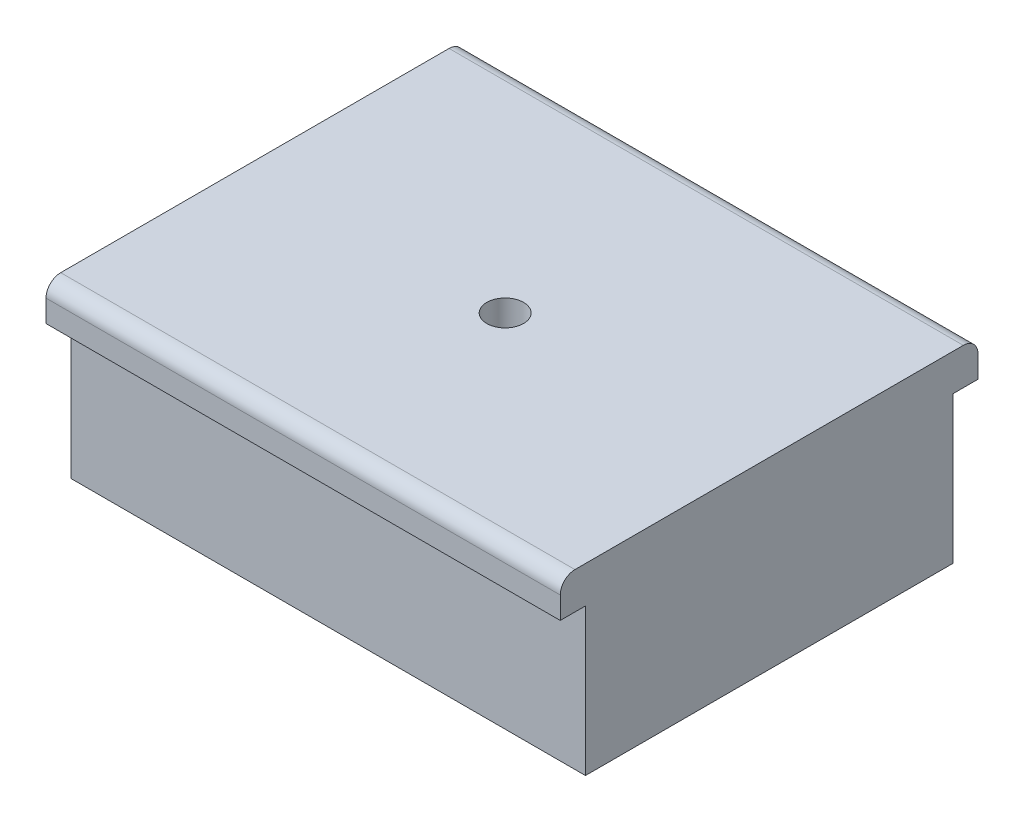
ISO-10303-21;
HEADER;
FILE_DESCRIPTION(('STEP AP214'),'2;1');
FILE_NAME('part.step','',(''),(''),'','','');
FILE_SCHEMA(('AUTOMOTIVE_DESIGN { 1 0 10303 214 1 1 1 1 }'));
ENDSEC;
DATA;
#1=APPLICATION_CONTEXT('core data for automotive mechanical design processes');
#2=APPLICATION_PROTOCOL_DEFINITION('international standard','automotive_design',2000,#1);
#3=PRODUCT_CONTEXT('',#1,'mechanical');
#4=PRODUCT('Part','Part','',(#3));
#5=PRODUCT_RELATED_PRODUCT_CATEGORY('part','',(#4));
#6=PRODUCT_DEFINITION_FORMATION('','',#4);
#7=PRODUCT_DEFINITION_CONTEXT('part definition',#1,'design');
#8=PRODUCT_DEFINITION('design','',#6,#7);
#9=PRODUCT_DEFINITION_SHAPE('','',#8);
#10=(LENGTH_UNIT() NAMED_UNIT(*) SI_UNIT(.MILLI.,.METRE.));
#11=(NAMED_UNIT(*) PLANE_ANGLE_UNIT() SI_UNIT($,.RADIAN.));
#12=(NAMED_UNIT(*) SI_UNIT($,.STERADIAN.) SOLID_ANGLE_UNIT());
#13=UNCERTAINTY_MEASURE_WITH_UNIT(LENGTH_MEASURE(1.E-05),#10,'distance_accuracy_value','');
#14=(GEOMETRIC_REPRESENTATION_CONTEXT(3) GLOBAL_UNCERTAINTY_ASSIGNED_CONTEXT((#13)) GLOBAL_UNIT_ASSIGNED_CONTEXT((#10,
#11,#12)) REPRESENTATION_CONTEXT('',''));
#15=CARTESIAN_POINT('',(0.,0.,0.));
#16=DIRECTION('',(0.,0.,1.));
#17=DIRECTION('',(1.,0.,0.));
#18=AXIS2_PLACEMENT_3D('',#15,#16,#17);
#19=CARTESIAN_POINT('',(1778.,508.,0.));
#20=DIRECTION('',(0.,0.,-1.));
#21=DIRECTION('',(0.,1.,0.));
#22=AXIS2_PLACEMENT_3D('',#19,#20,#21);
#23=PLANE('',#22);
#24=DIRECTION('',(0.,-1.,0.));
#25=VECTOR('',#24,1.);
#26=CARTESIAN_POINT('',(0.,508.,0.));
#27=LINE('',#26,#25);
#28=CARTESIAN_POINT('',(0.,508.,0.));
#29=VERTEX_POINT('',#28);
#30=CARTESIAN_POINT('',(0.,0.,0.));
#31=VERTEX_POINT('',#30);
#32=EDGE_CURVE('E151',#29,#31,#27,.T.);
#33=ORIENTED_EDGE('',*,*,#32,.T.);
#34=DIRECTION('',(-1.,0.,0.));
#35=VECTOR('',#34,1.);
#36=CARTESIAN_POINT('',(1778.,0.,0.));
#37=LINE('',#36,#35);
#38=CARTESIAN_POINT('',(1778.,0.,0.));
#39=VERTEX_POINT('',#38);
#40=EDGE_CURVE('E11',#39,#31,#37,.T.);
#41=ORIENTED_EDGE('',*,*,#40,.F.);
#42=DIRECTION('',(0.,-1.,0.));
#43=VECTOR('',#42,1.);
#44=CARTESIAN_POINT('',(1778.,508.,0.));
#45=LINE('',#44,#43);
#46=CARTESIAN_POINT('',(1778.,508.,0.));
#47=VERTEX_POINT('',#46);
#48=EDGE_CURVE('E175',#47,#39,#45,.T.);
#49=ORIENTED_EDGE('',*,*,#48,.F.);
#50=DIRECTION('',(-1.,0.,0.));
#51=VECTOR('',#50,1.);
#52=CARTESIAN_POINT('',(1778.,508.,0.));
#53=LINE('',#52,#51);
#54=EDGE_CURVE('E146',#47,#29,#53,.T.);
#55=ORIENTED_EDGE('',*,*,#54,.T.);
#56=EDGE_LOOP('',(#33,#41,#49,#55));
#57=FACE_BOUND('',#56,.T.);
#58=ADVANCED_FACE('F44',(#57),#23,.F.);
#59=CARTESIAN_POINT('',(1778.,0.,0.));
#60=DIRECTION('',(0.,1.,0.));
#61=DIRECTION('',(0.,0.,1.));
#62=AXIS2_PLACEMENT_3D('',#59,#60,#61);
#63=PLANE('',#62);
#64=CARTESIAN_POINT('',(889.,0.,-611.32732770544));
#65=DIRECTION('',(0.,1.,0.));
#66=DIRECTION('',(0.,0.,1.));
#67=AXIS2_PLACEMENT_3D('',#64,#65,#66);
#68=CIRCLE('',#67,63.5);
#69=CARTESIAN_POINT('',(889.,0.,-547.82732770544));
#70=VERTEX_POINT('',#69);
#71=EDGE_CURVE('E160',#70,#70,#68,.T.);
#72=ORIENTED_EDGE('',*,*,#71,.T.);
#73=EDGE_LOOP('',(#72));
#74=FACE_BOUND('',#73,.T.);
#75=DIRECTION('',(0.,0.,-1.));
#76=VECTOR('',#75,1.);
#77=CARTESIAN_POINT('',(0.,0.,0.));
#78=LINE('',#77,#76);
#79=CARTESIAN_POINT('',(0.,0.,-1270.));
#80=VERTEX_POINT('',#79);
#81=EDGE_CURVE('E157',#31,#80,#78,.T.);
#82=ORIENTED_EDGE('',*,*,#81,.T.);
#83=DIRECTION('',(-1.,0.,0.));
#84=VECTOR('',#83,1.);
#85=CARTESIAN_POINT('',(1778.,0.,-1270.));
#86=LINE('',#85,#84);
#87=CARTESIAN_POINT('',(1778.,0.,-1270.));
#88=VERTEX_POINT('',#87);
#89=EDGE_CURVE('E52',#88,#80,#86,.T.);
#90=ORIENTED_EDGE('',*,*,#89,.F.);
#91=DIRECTION('',(0.,0.,-1.));
#92=VECTOR('',#91,1.);
#93=CARTESIAN_POINT('',(1778.,0.,0.));
#94=LINE('',#93,#92);
#95=EDGE_CURVE('E109',#39,#88,#94,.T.);
#96=ORIENTED_EDGE('',*,*,#95,.F.);
#97=ORIENTED_EDGE('',*,*,#40,.T.);
#98=EDGE_LOOP('',(#82,#90,#96,#97));
#99=FACE_BOUND('',#98,.T.);
#100=ADVANCED_FACE('F249',(#74,#99),#63,.F.);
#101=CARTESIAN_POINT('',(1778.,0.,-1270.));
#102=DIRECTION('',(0.,0.,1.));
#103=DIRECTION('',(1.,0.,0.));
#104=AXIS2_PLACEMENT_3D('',#101,#102,#103);
#105=PLANE('',#104);
#106=DIRECTION('',(0.,1.,0.));
#107=VECTOR('',#106,1.);
#108=CARTESIAN_POINT('',(0.,0.,-1270.));
#109=LINE('',#108,#107);
#110=CARTESIAN_POINT('',(0.,508.,-1270.));
#111=VERTEX_POINT('',#110);
#112=EDGE_CURVE('E159',#80,#111,#109,.T.);
#113=ORIENTED_EDGE('',*,*,#112,.T.);
#114=DIRECTION('',(-1.,0.,0.));
#115=VECTOR('',#114,1.);
#116=CARTESIAN_POINT('',(1778.,508.,-1270.));
#117=LINE('',#116,#115);
#118=CARTESIAN_POINT('',(1778.,508.,-1270.));
#119=VERTEX_POINT('',#118);
#120=EDGE_CURVE('E184',#119,#111,#117,.T.);
#121=ORIENTED_EDGE('',*,*,#120,.F.);
#122=DIRECTION('',(0.,1.,0.));
#123=VECTOR('',#122,1.);
#124=CARTESIAN_POINT('',(1778.,0.,-1270.));
#125=LINE('',#124,#123);
#126=EDGE_CURVE('E194',#88,#119,#125,.T.);
#127=ORIENTED_EDGE('',*,*,#126,.F.);
#128=ORIENTED_EDGE('',*,*,#89,.T.);
#129=EDGE_LOOP('',(#113,#121,#127,#128));
#130=FACE_BOUND('',#129,.T.);
#131=ADVANCED_FACE('F192',(#130),#105,.F.);
#132=CARTESIAN_POINT('',(1778.,508.,-1270.));
#133=DIRECTION('',(0.,1.,0.));
#134=DIRECTION('',(0.,0.,1.));
#135=AXIS2_PLACEMENT_3D('',#132,#133,#134);
#136=PLANE('',#135);
#137=DIRECTION('',(0.,0.,-1.));
#138=VECTOR('',#137,1.);
#139=CARTESIAN_POINT('',(0.,508.,-1270.));
#140=LINE('',#139,#138);
#141=CARTESIAN_POINT('',(0.,508.,-1357.17267229456));
#142=VERTEX_POINT('',#141);
#143=EDGE_CURVE('E163',#111,#142,#140,.T.);
#144=ORIENTED_EDGE('',*,*,#143,.T.);
#145=DIRECTION('',(-1.,0.,0.));
#146=VECTOR('',#145,1.);
#147=CARTESIAN_POINT('',(1778.,508.,-1357.17267229456));
#148=LINE('',#147,#146);
#149=CARTESIAN_POINT('',(1778.,508.,-1357.17267229456));
#150=VERTEX_POINT('',#149);
#151=EDGE_CURVE('E185',#150,#142,#148,.T.);
#152=ORIENTED_EDGE('',*,*,#151,.F.);
#153=DIRECTION('',(0.,0.,-1.));
#154=VECTOR('',#153,1.);
#155=CARTESIAN_POINT('',(1778.,508.,-1270.));
#156=LINE('',#155,#154);
#157=EDGE_CURVE('E213',#119,#150,#156,.T.);
#158=ORIENTED_EDGE('',*,*,#157,.F.);
#159=ORIENTED_EDGE('',*,*,#120,.T.);
#160=EDGE_LOOP('',(#144,#152,#158,#159));
#161=FACE_BOUND('',#160,.T.);
#162=ADVANCED_FACE('F205',(#161),#136,.F.);
#163=CARTESIAN_POINT('',(1778.,508.,-1357.17267229456));
#164=DIRECTION('',(0.,0.,1.));
#165=DIRECTION('',(1.,0.,0.));
#166=AXIS2_PLACEMENT_3D('',#163,#164,#165);
#167=PLANE('',#166);
#168=DIRECTION('',(0.,1.,0.));
#169=VECTOR('',#168,1.);
#170=CARTESIAN_POINT('',(0.,508.,-1357.17267229456));
#171=LINE('',#170,#169);
#172=CARTESIAN_POINT('',(0.,584.2,-1357.17267229456));
#173=VERTEX_POINT('',#172);
#174=EDGE_CURVE('E161',#142,#173,#171,.T.);
#175=ORIENTED_EDGE('',*,*,#174,.T.);
#176=DIRECTION('',(-1.,0.,0.));
#177=VECTOR('',#176,1.);
#178=CARTESIAN_POINT('',(1778.,584.2,-1357.17267229456));
#179=LINE('',#178,#177);
#180=CARTESIAN_POINT('',(1778.,584.2,-1357.17267229456));
#181=VERTEX_POINT('',#180);
#182=EDGE_CURVE('E177',#181,#173,#179,.T.);
#183=ORIENTED_EDGE('',*,*,#182,.F.);
#184=DIRECTION('',(0.,1.,0.));
#185=VECTOR('',#184,1.);
#186=CARTESIAN_POINT('',(1778.,508.,-1357.17267229456));
#187=LINE('',#186,#185);
#188=EDGE_CURVE('E206',#150,#181,#187,.T.);
#189=ORIENTED_EDGE('',*,*,#188,.F.);
#190=ORIENTED_EDGE('',*,*,#151,.T.);
#191=EDGE_LOOP('',(#175,#183,#189,#190));
#192=FACE_BOUND('',#191,.T.);
#193=ADVANCED_FACE('F208',(#192),#167,.F.);
#194=CARTESIAN_POINT('',(1778.,584.2,-1306.37267229456));
#195=DIRECTION('',(-1.,0.,0.));
#196=DIRECTION('',(0.,0.,1.));
#197=AXIS2_PLACEMENT_3D('',#194,#195,#196);
#198=CYLINDRICAL_SURFACE('',#197,50.8);
#199=CARTESIAN_POINT('',(0.,584.2,-1306.37267229456));
#200=DIRECTION('',(1.,0.,0.));
#201=DIRECTION('',(0.,0.,-1.));
#202=AXIS2_PLACEMENT_3D('',#199,#200,#201);
#203=CIRCLE('',#202,50.8);
#204=CARTESIAN_POINT('',(0.,635.,-1306.37267229456));
#205=VERTEX_POINT('',#204);
#206=EDGE_CURVE('E164',#173,#205,#203,.T.);
#207=ORIENTED_EDGE('',*,*,#206,.T.);
#208=DIRECTION('',(-1.,0.,0.));
#209=VECTOR('',#208,1.);
#210=CARTESIAN_POINT('',(1778.,635.,-1306.37267229456));
#211=LINE('',#210,#209);
#212=CARTESIAN_POINT('',(1778.,635.,-1306.37267229456));
#213=VERTEX_POINT('',#212);
#214=EDGE_CURVE('E176',#213,#205,#211,.T.);
#215=ORIENTED_EDGE('',*,*,#214,.F.);
#216=CARTESIAN_POINT('',(1778.,584.2,-1306.37267229456));
#217=DIRECTION('',(1.,0.,0.));
#218=DIRECTION('',(0.,0.,-1.));
#219=AXIS2_PLACEMENT_3D('',#216,#217,#218);
#220=CIRCLE('',#219,50.8);
#221=EDGE_CURVE('E209',#181,#213,#220,.T.);
#222=ORIENTED_EDGE('',*,*,#221,.F.);
#223=ORIENTED_EDGE('',*,*,#182,.T.);
#224=EDGE_LOOP('',(#207,#215,#222,#223));
#225=FACE_BOUND('',#224,.T.);
#226=ADVANCED_FACE('F231',(#225),#198,.T.);
#227=CARTESIAN_POINT('',(1778.,635.,-1306.37267229456));
#228=DIRECTION('',(0.,-1.,0.));
#229=DIRECTION('',(0.,0.,-1.));
#230=AXIS2_PLACEMENT_3D('',#227,#228,#229);
#231=PLANE('',#230);
#232=CARTESIAN_POINT('',(889.,635.,-611.32732770544));
#233=DIRECTION('',(0.,1.,0.));
#234=DIRECTION('',(0.,0.,1.));
#235=AXIS2_PLACEMENT_3D('',#232,#233,#234);
#236=CIRCLE('',#235,63.5);
#237=CARTESIAN_POINT('',(889.,635.,-547.82732770544));
#238=VERTEX_POINT('',#237);
#239=EDGE_CURVE('E221',#238,#238,#236,.T.);
#240=ORIENTED_EDGE('',*,*,#239,.F.);
#241=EDGE_LOOP('',(#240));
#242=FACE_BOUND('',#241,.T.);
#243=DIRECTION('',(0.,0.,1.));
#244=VECTOR('',#243,1.);
#245=CARTESIAN_POINT('',(0.,635.,-1306.37267229456));
#246=LINE('',#245,#244);
#247=CARTESIAN_POINT('',(0.,635.,36.3726722945599));
#248=VERTEX_POINT('',#247);
#249=EDGE_CURVE('E167',#205,#248,#246,.T.);
#250=ORIENTED_EDGE('',*,*,#249,.T.);
#251=DIRECTION('',(-1.,0.,0.));
#252=VECTOR('',#251,1.);
#253=CARTESIAN_POINT('',(1778.,635.,36.3726722945599));
#254=LINE('',#253,#252);
#255=CARTESIAN_POINT('',(1778.,635.,36.3726722945599));
#256=VERTEX_POINT('',#255);
#257=EDGE_CURVE('E143',#256,#248,#254,.T.);
#258=ORIENTED_EDGE('',*,*,#257,.F.);
#259=DIRECTION('',(0.,0.,1.));
#260=VECTOR('',#259,1.);
#261=CARTESIAN_POINT('',(1778.,635.,-1306.37267229456));
#262=LINE('',#261,#260);
#263=EDGE_CURVE('E134',#213,#256,#262,.T.);
#264=ORIENTED_EDGE('',*,*,#263,.F.);
#265=ORIENTED_EDGE('',*,*,#214,.T.);
#266=EDGE_LOOP('',(#250,#258,#264,#265));
#267=FACE_BOUND('',#266,.T.);
#268=ADVANCED_FACE('F228',(#242,#267),#231,.F.);
#269=CARTESIAN_POINT('',(1778.,584.2,36.3726722945603));
#270=DIRECTION('',(-1.,0.,0.));
#271=DIRECTION('',(0.,0.,1.));
#272=AXIS2_PLACEMENT_3D('',#269,#270,#271);
#273=CYLINDRICAL_SURFACE('',#272,50.8);
#274=CARTESIAN_POINT('',(0.,584.2,36.3726722945603));
#275=DIRECTION('',(1.,0.,0.));
#276=DIRECTION('',(0.,0.,-1.));
#277=AXIS2_PLACEMENT_3D('',#274,#275,#276);
#278=CIRCLE('',#277,50.8);
#279=CARTESIAN_POINT('',(0.,584.2,87.1726722945602));
#280=VERTEX_POINT('',#279);
#281=EDGE_CURVE('E142',#248,#280,#278,.T.);
#282=ORIENTED_EDGE('',*,*,#281,.T.);
#283=DIRECTION('',(-1.,0.,0.));
#284=VECTOR('',#283,1.);
#285=CARTESIAN_POINT('',(1778.,584.2,87.1726722945602));
#286=LINE('',#285,#284);
#287=CARTESIAN_POINT('',(1778.,584.2,87.1726722945602));
#288=VERTEX_POINT('',#287);
#289=EDGE_CURVE('E139',#288,#280,#286,.T.);
#290=ORIENTED_EDGE('',*,*,#289,.F.);
#291=CARTESIAN_POINT('',(1778.,584.2,36.3726722945603));
#292=DIRECTION('',(1.,0.,0.));
#293=DIRECTION('',(0.,0.,-1.));
#294=AXIS2_PLACEMENT_3D('',#291,#292,#293);
#295=CIRCLE('',#294,50.8);
#296=EDGE_CURVE('E129',#256,#288,#295,.T.);
#297=ORIENTED_EDGE('',*,*,#296,.F.);
#298=ORIENTED_EDGE('',*,*,#257,.T.);
#299=EDGE_LOOP('',(#282,#290,#297,#298));
#300=FACE_BOUND('',#299,.T.);
#301=ADVANCED_FACE('F141',(#300),#273,.T.);
#302=CARTESIAN_POINT('',(1778.,584.2,87.1726722945603));
#303=DIRECTION('',(0.,0.,-1.));
#304=DIRECTION('',(-1.,0.,0.));
#305=AXIS2_PLACEMENT_3D('',#302,#303,#304);
#306=PLANE('',#305);
#307=DIRECTION('',(0.,-1.,0.));
#308=VECTOR('',#307,1.);
#309=CARTESIAN_POINT('',(0.,584.2,87.1726722945603));
#310=LINE('',#309,#308);
#311=CARTESIAN_POINT('',(0.,508.,87.1726722945603));
#312=VERTEX_POINT('',#311);
#313=EDGE_CURVE('E96',#280,#312,#310,.T.);
#314=ORIENTED_EDGE('',*,*,#313,.T.);
#315=DIRECTION('',(-1.,0.,0.));
#316=VECTOR('',#315,1.);
#317=CARTESIAN_POINT('',(1778.,508.,87.1726722945603));
#318=LINE('',#317,#316);
#319=CARTESIAN_POINT('',(1778.,508.,87.1726722945603));
#320=VERTEX_POINT('',#319);
#321=EDGE_CURVE('E144',#320,#312,#318,.T.);
#322=ORIENTED_EDGE('',*,*,#321,.F.);
#323=DIRECTION('',(0.,-1.,0.));
#324=VECTOR('',#323,1.);
#325=CARTESIAN_POINT('',(1778.,584.2,87.1726722945603));
#326=LINE('',#325,#324);
#327=EDGE_CURVE('E133',#288,#320,#326,.T.);
#328=ORIENTED_EDGE('',*,*,#327,.F.);
#329=ORIENTED_EDGE('',*,*,#289,.T.);
#330=EDGE_LOOP('',(#314,#322,#328,#329));
#331=FACE_BOUND('',#330,.T.);
#332=ADVANCED_FACE('F150',(#331),#306,.F.);
#333=CARTESIAN_POINT('',(1778.,508.,87.1726722945603));
#334=DIRECTION('',(0.,1.,0.));
#335=DIRECTION('',(0.,0.,1.));
#336=AXIS2_PLACEMENT_3D('',#333,#334,#335);
#337=PLANE('',#336);
#338=DIRECTION('',(0.,0.,-1.));
#339=VECTOR('',#338,1.);
#340=CARTESIAN_POINT('',(0.,508.,87.1726722945603));
#341=LINE('',#340,#339);
#342=EDGE_CURVE('E105',#312,#29,#341,.T.);
#343=ORIENTED_EDGE('',*,*,#342,.T.);
#344=ORIENTED_EDGE('',*,*,#54,.F.);
#345=DIRECTION('',(0.,0.,-1.));
#346=VECTOR('',#345,1.);
#347=CARTESIAN_POINT('',(1778.,508.,87.1726722945603));
#348=LINE('',#347,#346);
#349=EDGE_CURVE('E63',#320,#47,#348,.T.);
#350=ORIENTED_EDGE('',*,*,#349,.F.);
#351=ORIENTED_EDGE('',*,*,#321,.T.);
#352=EDGE_LOOP('',(#343,#344,#350,#351));
#353=FACE_BOUND('',#352,.T.);
#354=ADVANCED_FACE('F239',(#353),#337,.F.);
#355=CARTESIAN_POINT('',(1778.,584.2,-1306.37267229456));
#356=DIRECTION('',(1.,0.,0.));
#357=DIRECTION('',(0.,0.,-1.));
#358=AXIS2_PLACEMENT_3D('',#355,#356,#357);
#359=PLANE('',#358);
#360=ORIENTED_EDGE('',*,*,#48,.T.);
#361=ORIENTED_EDGE('',*,*,#95,.T.);
#362=ORIENTED_EDGE('',*,*,#126,.T.);
#363=ORIENTED_EDGE('',*,*,#157,.T.);
#364=ORIENTED_EDGE('',*,*,#188,.T.);
#365=ORIENTED_EDGE('',*,*,#221,.T.);
#366=ORIENTED_EDGE('',*,*,#263,.T.);
#367=ORIENTED_EDGE('',*,*,#296,.T.);
#368=ORIENTED_EDGE('',*,*,#327,.T.);
#369=ORIENTED_EDGE('',*,*,#349,.T.);
#370=EDGE_LOOP('',(#360,#361,#362,#363,#364,#365,#366,#367,#368,#369));
#371=FACE_BOUND('',#370,.T.);
#372=ADVANCED_FACE('F131',(#371),#359,.T.);
#373=CARTESIAN_POINT('',(0.,584.2,-1306.37267229456));
#374=DIRECTION('',(1.,0.,0.));
#375=DIRECTION('',(0.,0.,-1.));
#376=AXIS2_PLACEMENT_3D('',#373,#374,#375);
#377=PLANE('',#376);
#378=ORIENTED_EDGE('',*,*,#32,.F.);
#379=ORIENTED_EDGE('',*,*,#342,.F.);
#380=ORIENTED_EDGE('',*,*,#313,.F.);
#381=ORIENTED_EDGE('',*,*,#281,.F.);
#382=ORIENTED_EDGE('',*,*,#249,.F.);
#383=ORIENTED_EDGE('',*,*,#206,.F.);
#384=ORIENTED_EDGE('',*,*,#174,.F.);
#385=ORIENTED_EDGE('',*,*,#143,.F.);
#386=ORIENTED_EDGE('',*,*,#112,.F.);
#387=ORIENTED_EDGE('',*,*,#81,.F.);
#388=EDGE_LOOP('',(#378,#379,#380,#381,#382,#383,#384,#385,#386,#387));
#389=FACE_BOUND('',#388,.T.);
#390=ADVANCED_FACE('F200',(#389),#377,.F.);
#391=CARTESIAN_POINT('',(889.,-1143.,-611.32732770544));
#392=DIRECTION('',(0.,1.,0.));
#393=DIRECTION('',(0.,0.,1.));
#394=AXIS2_PLACEMENT_3D('',#391,#392,#393);
#395=CYLINDRICAL_SURFACE('',#394,63.5);
#396=ORIENTED_EDGE('',*,*,#239,.T.);
#397=EDGE_LOOP('',(#396));
#398=FACE_BOUND('',#397,.T.);
#399=ORIENTED_EDGE('',*,*,#71,.F.);
#400=EDGE_LOOP('',(#399));
#401=FACE_BOUND('',#400,.T.);
#402=ADVANCED_FACE('F224',(#398,#401),#395,.F.);
#403=CLOSED_SHELL('',(#58,#100,#131,#162,#193,#226,#268,#301,#332,#354,#372,#390,#402));
#404=MANIFOLD_SOLID_BREP('B2',#403);
#405=ADVANCED_BREP_SHAPE_REPRESENTATION('',(#18,#404),#14);
#406=SHAPE_DEFINITION_REPRESENTATION(#9,#405);
ENDSEC;
END-ISO-10303-21;
